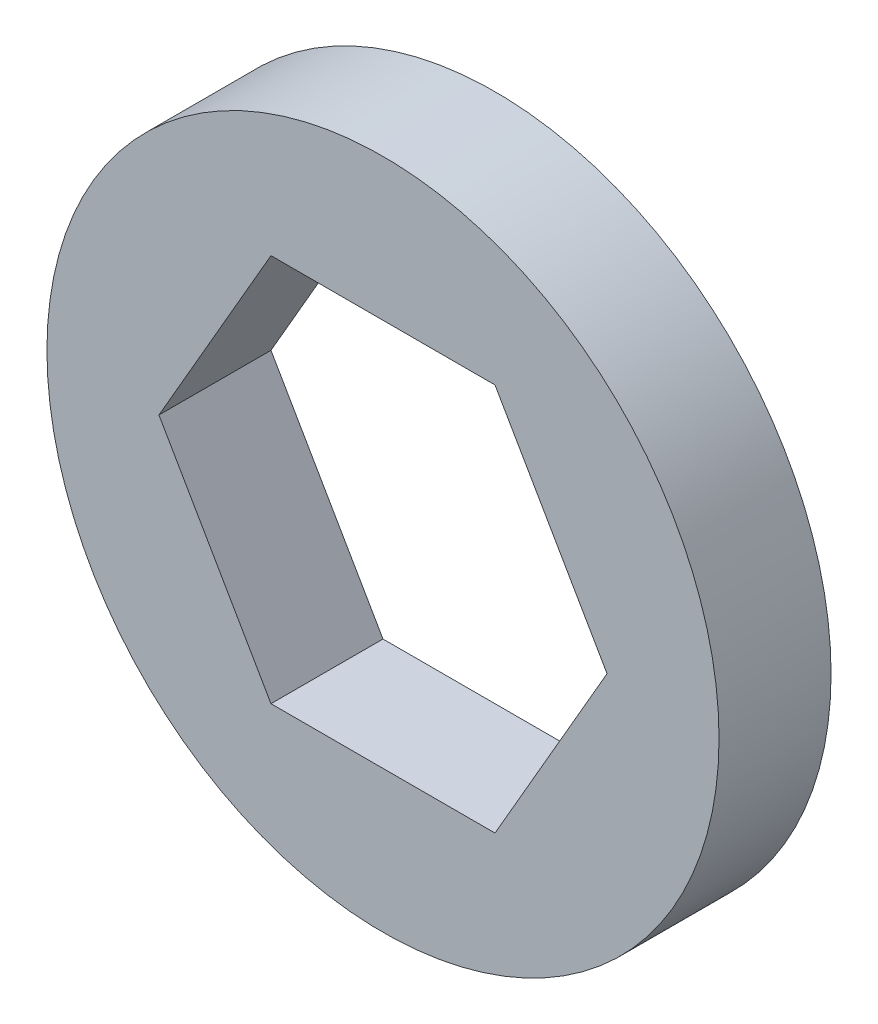
ISO-10303-21;
HEADER;
FILE_DESCRIPTION(('STEP AP214'),'2;1');
FILE_NAME('part.step','',(''),(''),'','','');
FILE_SCHEMA(('AUTOMOTIVE_DESIGN { 1 0 10303 214 1 1 1 1 }'));
ENDSEC;
DATA;
#1=APPLICATION_CONTEXT('core data for automotive mechanical design processes');
#2=APPLICATION_PROTOCOL_DEFINITION('international standard','automotive_design',2000,#1);
#3=PRODUCT_CONTEXT('',#1,'mechanical');
#4=PRODUCT('Part','Part','',(#3));
#5=PRODUCT_RELATED_PRODUCT_CATEGORY('part','',(#4));
#6=PRODUCT_DEFINITION_FORMATION('','',#4);
#7=PRODUCT_DEFINITION_CONTEXT('part definition',#1,'design');
#8=PRODUCT_DEFINITION('design','',#6,#7);
#9=PRODUCT_DEFINITION_SHAPE('','',#8);
#10=(LENGTH_UNIT() NAMED_UNIT(*) SI_UNIT(.MILLI.,.METRE.));
#11=(NAMED_UNIT(*) PLANE_ANGLE_UNIT() SI_UNIT($,.RADIAN.));
#12=(NAMED_UNIT(*) SI_UNIT($,.STERADIAN.) SOLID_ANGLE_UNIT());
#13=UNCERTAINTY_MEASURE_WITH_UNIT(LENGTH_MEASURE(1.E-05),#10,'distance_accuracy_value','');
#14=(GEOMETRIC_REPRESENTATION_CONTEXT(3) GLOBAL_UNCERTAINTY_ASSIGNED_CONTEXT((#13)) GLOBAL_UNIT_ASSIGNED_CONTEXT((#10,
#11,#12)) REPRESENTATION_CONTEXT('',''));
#15=CARTESIAN_POINT('',(0.,0.,0.));
#16=DIRECTION('',(0.,0.,1.));
#17=DIRECTION('',(1.,0.,0.));
#18=AXIS2_PLACEMENT_3D('',#15,#16,#17);
#19=CARTESIAN_POINT('',(0.,0.,3.175));
#20=DIRECTION('',(0.,0.,1.));
#21=DIRECTION('',(1.,0.,0.));
#22=AXIS2_PLACEMENT_3D('',#19,#20,#21);
#23=PLANE('',#22);
#24=CARTESIAN_POINT('',(0.,0.,3.175));
#25=DIRECTION('',(0.,0.,1.));
#26=DIRECTION('',(1.,0.,0.));
#27=AXIS2_PLACEMENT_3D('',#24,#25,#26);
#28=CIRCLE('',#27,9.525);
#29=CARTESIAN_POINT('',(9.525,0.,3.175));
#30=VERTEX_POINT('',#29);
#31=EDGE_CURVE('E11',#30,#30,#28,.T.);
#32=ORIENTED_EDGE('',*,*,#31,.T.);
#33=EDGE_LOOP('',(#32));
#34=FACE_BOUND('',#33,.T.);
#35=DIRECTION('',(-0.5,-0.866025403784438,0.));
#36=VECTOR('',#35,1.);
#37=CARTESIAN_POINT('',(-3.175,5.49926131403119,3.175));
#38=LINE('',#37,#36);
#39=CARTESIAN_POINT('',(-3.175,5.49926131403119,3.175));
#40=VERTEX_POINT('',#39);
#41=CARTESIAN_POINT('',(-6.35,0.,3.175));
#42=VERTEX_POINT('',#41);
#43=EDGE_CURVE('E99',#40,#42,#38,.T.);
#44=ORIENTED_EDGE('',*,*,#43,.F.);
#45=DIRECTION('',(-1.,0.,0.));
#46=VECTOR('',#45,1.);
#47=CARTESIAN_POINT('',(3.175,5.49926131403119,3.175));
#48=LINE('',#47,#46);
#49=CARTESIAN_POINT('',(3.175,5.49926131403119,3.175));
#50=VERTEX_POINT('',#49);
#51=EDGE_CURVE('E91',#50,#40,#48,.T.);
#52=ORIENTED_EDGE('',*,*,#51,.F.);
#53=DIRECTION('',(-0.5,0.866025403784438,0.));
#54=VECTOR('',#53,1.);
#55=CARTESIAN_POINT('',(6.35,0.,3.175));
#56=LINE('',#55,#54);
#57=CARTESIAN_POINT('',(6.35,0.,3.175));
#58=VERTEX_POINT('',#57);
#59=EDGE_CURVE('E119',#58,#50,#56,.T.);
#60=ORIENTED_EDGE('',*,*,#59,.F.);
#61=DIRECTION('',(0.5,0.866025403784438,0.));
#62=VECTOR('',#61,1.);
#63=CARTESIAN_POINT('',(3.175,-5.49926131403118,3.175));
#64=LINE('',#63,#62);
#65=CARTESIAN_POINT('',(3.175,-5.49926131403118,3.175));
#66=VERTEX_POINT('',#65);
#67=EDGE_CURVE('E117',#66,#58,#64,.T.);
#68=ORIENTED_EDGE('',*,*,#67,.F.);
#69=DIRECTION('',(1.,0.,0.));
#70=VECTOR('',#69,1.);
#71=CARTESIAN_POINT('',(-3.175,-5.49926131403119,3.175));
#72=LINE('',#71,#70);
#73=CARTESIAN_POINT('',(-3.175,-5.49926131403119,3.175));
#74=VERTEX_POINT('',#73);
#75=EDGE_CURVE('E113',#74,#66,#72,.T.);
#76=ORIENTED_EDGE('',*,*,#75,.F.);
#77=DIRECTION('',(0.5,-0.866025403784438,0.));
#78=VECTOR('',#77,1.);
#79=CARTESIAN_POINT('',(-6.35,0.,3.175));
#80=LINE('',#79,#78);
#81=EDGE_CURVE('E111',#42,#74,#80,.T.);
#82=ORIENTED_EDGE('',*,*,#81,.F.);
#83=EDGE_LOOP('',(#44,#52,#60,#68,#76,#82));
#84=FACE_BOUND('',#83,.T.);
#85=ADVANCED_FACE('F38',(#34,#84),#23,.T.);
#86=CARTESIAN_POINT('',(0.,0.,0.));
#87=DIRECTION('',(0.,0.,1.));
#88=DIRECTION('',(1.,0.,0.));
#89=AXIS2_PLACEMENT_3D('',#86,#87,#88);
#90=PLANE('',#89);
#91=CARTESIAN_POINT('',(0.,0.,0.));
#92=DIRECTION('',(0.,0.,1.));
#93=DIRECTION('',(1.,0.,0.));
#94=AXIS2_PLACEMENT_3D('',#91,#92,#93);
#95=CIRCLE('',#94,9.525);
#96=CARTESIAN_POINT('',(9.525,0.,0.));
#97=VERTEX_POINT('',#96);
#98=EDGE_CURVE('E42',#97,#97,#95,.T.);
#99=ORIENTED_EDGE('',*,*,#98,.F.);
#100=EDGE_LOOP('',(#99));
#101=FACE_BOUND('',#100,.T.);
#102=DIRECTION('',(-1.,0.,0.));
#103=VECTOR('',#102,1.);
#104=CARTESIAN_POINT('',(3.175,5.49926131403119,0.));
#105=LINE('',#104,#103);
#106=CARTESIAN_POINT('',(3.175,5.49926131403119,0.));
#107=VERTEX_POINT('',#106);
#108=CARTESIAN_POINT('',(-3.175,5.49926131403119,0.));
#109=VERTEX_POINT('',#108);
#110=EDGE_CURVE('E61',#107,#109,#105,.T.);
#111=ORIENTED_EDGE('',*,*,#110,.T.);
#112=DIRECTION('',(-0.5,-0.866025403784438,0.));
#113=VECTOR('',#112,1.);
#114=CARTESIAN_POINT('',(-3.175,5.49926131403119,0.));
#115=LINE('',#114,#113);
#116=CARTESIAN_POINT('',(-6.35,0.,0.));
#117=VERTEX_POINT('',#116);
#118=EDGE_CURVE('E106',#109,#117,#115,.T.);
#119=ORIENTED_EDGE('',*,*,#118,.T.);
#120=DIRECTION('',(0.5,-0.866025403784438,0.));
#121=VECTOR('',#120,1.);
#122=CARTESIAN_POINT('',(-6.35,0.,0.));
#123=LINE('',#122,#121);
#124=CARTESIAN_POINT('',(-3.175,-5.49926131403119,0.));
#125=VERTEX_POINT('',#124);
#126=EDGE_CURVE('E123',#117,#125,#123,.T.);
#127=ORIENTED_EDGE('',*,*,#126,.T.);
#128=DIRECTION('',(1.,0.,0.));
#129=VECTOR('',#128,1.);
#130=CARTESIAN_POINT('',(-3.175,-5.49926131403119,0.));
#131=LINE('',#130,#129);
#132=CARTESIAN_POINT('',(3.175,-5.49926131403118,0.));
#133=VERTEX_POINT('',#132);
#134=EDGE_CURVE('E126',#125,#133,#131,.T.);
#135=ORIENTED_EDGE('',*,*,#134,.T.);
#136=DIRECTION('',(0.5,0.866025403784438,0.));
#137=VECTOR('',#136,1.);
#138=CARTESIAN_POINT('',(3.175,-5.49926131403118,0.));
#139=LINE('',#138,#137);
#140=CARTESIAN_POINT('',(6.35,0.,0.));
#141=VERTEX_POINT('',#140);
#142=EDGE_CURVE('E129',#133,#141,#139,.T.);
#143=ORIENTED_EDGE('',*,*,#142,.T.);
#144=DIRECTION('',(-0.5,0.866025403784438,0.));
#145=VECTOR('',#144,1.);
#146=CARTESIAN_POINT('',(6.35,0.,0.));
#147=LINE('',#146,#145);
#148=EDGE_CURVE('E100',#141,#107,#147,.T.);
#149=ORIENTED_EDGE('',*,*,#148,.T.);
#150=EDGE_LOOP('',(#111,#119,#127,#135,#143,#149));
#151=FACE_BOUND('',#150,.T.);
#152=ADVANCED_FACE('F146',(#101,#151),#90,.F.);
#153=CARTESIAN_POINT('',(0.,0.,3.175));
#154=DIRECTION('',(0.,0.,-1.));
#155=DIRECTION('',(-1.,0.,0.));
#156=AXIS2_PLACEMENT_3D('',#153,#154,#155);
#157=CYLINDRICAL_SURFACE('',#156,9.525);
#158=ORIENTED_EDGE('',*,*,#31,.F.);
#159=EDGE_LOOP('',(#158));
#160=FACE_BOUND('',#159,.T.);
#161=ORIENTED_EDGE('',*,*,#98,.T.);
#162=EDGE_LOOP('',(#161));
#163=FACE_BOUND('',#162,.T.);
#164=ADVANCED_FACE('F40',(#160,#163),#157,.T.);
#165=CARTESIAN_POINT('',(3.175,5.49926131403119,3.175));
#166=DIRECTION('',(0.,-1.,0.));
#167=DIRECTION('',(0.,0.,-1.));
#168=AXIS2_PLACEMENT_3D('',#165,#166,#167);
#169=PLANE('',#168);
#170=ORIENTED_EDGE('',*,*,#110,.F.);
#171=DIRECTION('',(0.,0.,-1.));
#172=VECTOR('',#171,1.);
#173=CARTESIAN_POINT('',(3.175,5.49926131403119,3.175));
#174=LINE('',#173,#172);
#175=EDGE_CURVE('E95',#50,#107,#174,.T.);
#176=ORIENTED_EDGE('',*,*,#175,.F.);
#177=ORIENTED_EDGE('',*,*,#51,.T.);
#178=DIRECTION('',(0.,0.,-1.));
#179=VECTOR('',#178,1.);
#180=CARTESIAN_POINT('',(-3.175,5.49926131403119,3.175));
#181=LINE('',#180,#179);
#182=EDGE_CURVE('E94',#40,#109,#181,.T.);
#183=ORIENTED_EDGE('',*,*,#182,.T.);
#184=EDGE_LOOP('',(#170,#176,#177,#183));
#185=FACE_BOUND('',#184,.T.);
#186=ADVANCED_FACE('F93',(#185),#169,.T.);
#187=CARTESIAN_POINT('',(-3.175,5.49926131403119,3.175));
#188=DIRECTION('',(0.866025403784439,-0.5,0.));
#189=DIRECTION('',(0.5,0.866025403784439,0.));
#190=AXIS2_PLACEMENT_3D('',#187,#188,#189);
#191=PLANE('',#190);
#192=ORIENTED_EDGE('',*,*,#118,.F.);
#193=ORIENTED_EDGE('',*,*,#182,.F.);
#194=ORIENTED_EDGE('',*,*,#43,.T.);
#195=DIRECTION('',(0.,0.,-1.));
#196=VECTOR('',#195,1.);
#197=CARTESIAN_POINT('',(-6.35,0.,3.175));
#198=LINE('',#197,#196);
#199=EDGE_CURVE('E107',#42,#117,#198,.T.);
#200=ORIENTED_EDGE('',*,*,#199,.T.);
#201=EDGE_LOOP('',(#192,#193,#194,#200));
#202=FACE_BOUND('',#201,.T.);
#203=ADVANCED_FACE('F103',(#202),#191,.T.);
#204=CARTESIAN_POINT('',(-6.35,0.,3.175));
#205=DIRECTION('',(0.866025403784438,0.5,0.));
#206=DIRECTION('',(-0.5,0.866025403784439,0.));
#207=AXIS2_PLACEMENT_3D('',#204,#205,#206);
#208=PLANE('',#207);
#209=ORIENTED_EDGE('',*,*,#126,.F.);
#210=ORIENTED_EDGE('',*,*,#199,.F.);
#211=ORIENTED_EDGE('',*,*,#81,.T.);
#212=DIRECTION('',(0.,0.,-1.));
#213=VECTOR('',#212,1.);
#214=CARTESIAN_POINT('',(-3.175,-5.49926131403119,3.175));
#215=LINE('',#214,#213);
#216=EDGE_CURVE('E138',#74,#125,#215,.T.);
#217=ORIENTED_EDGE('',*,*,#216,.T.);
#218=EDGE_LOOP('',(#209,#210,#211,#217));
#219=FACE_BOUND('',#218,.T.);
#220=ADVANCED_FACE('F142',(#219),#208,.T.);
#221=CARTESIAN_POINT('',(-3.175,-5.49926131403119,3.175));
#222=DIRECTION('',(0.,1.,0.));
#223=DIRECTION('',(-1.,0.,0.));
#224=AXIS2_PLACEMENT_3D('',#221,#222,#223);
#225=PLANE('',#224);
#226=ORIENTED_EDGE('',*,*,#134,.F.);
#227=ORIENTED_EDGE('',*,*,#216,.F.);
#228=ORIENTED_EDGE('',*,*,#75,.T.);
#229=DIRECTION('',(0.,0.,-1.));
#230=VECTOR('',#229,1.);
#231=CARTESIAN_POINT('',(3.175,-5.49926131403118,3.175));
#232=LINE('',#231,#230);
#233=EDGE_CURVE('E136',#66,#133,#232,.T.);
#234=ORIENTED_EDGE('',*,*,#233,.T.);
#235=EDGE_LOOP('',(#226,#227,#228,#234));
#236=FACE_BOUND('',#235,.T.);
#237=ADVANCED_FACE('F154',(#236),#225,.T.);
#238=CARTESIAN_POINT('',(3.175,-5.49926131403118,3.175));
#239=DIRECTION('',(-0.866025403784439,0.5,0.));
#240=DIRECTION('',(-0.5,-0.866025403784439,0.));
#241=AXIS2_PLACEMENT_3D('',#238,#239,#240);
#242=PLANE('',#241);
#243=ORIENTED_EDGE('',*,*,#142,.F.);
#244=ORIENTED_EDGE('',*,*,#233,.F.);
#245=ORIENTED_EDGE('',*,*,#67,.T.);
#246=DIRECTION('',(0.,0.,-1.));
#247=VECTOR('',#246,1.);
#248=CARTESIAN_POINT('',(6.35,0.,3.175));
#249=LINE('',#248,#247);
#250=EDGE_CURVE('E53',#58,#141,#249,.T.);
#251=ORIENTED_EDGE('',*,*,#250,.T.);
#252=EDGE_LOOP('',(#243,#244,#245,#251));
#253=FACE_BOUND('',#252,.T.);
#254=ADVANCED_FACE('F152',(#253),#242,.T.);
#255=CARTESIAN_POINT('',(6.35,0.,3.175));
#256=DIRECTION('',(-0.866025403784438,-0.5,0.));
#257=DIRECTION('',(0.5,-0.866025403784438,0.));
#258=AXIS2_PLACEMENT_3D('',#255,#256,#257);
#259=PLANE('',#258);
#260=ORIENTED_EDGE('',*,*,#148,.F.);
#261=ORIENTED_EDGE('',*,*,#250,.F.);
#262=ORIENTED_EDGE('',*,*,#59,.T.);
#263=ORIENTED_EDGE('',*,*,#175,.T.);
#264=EDGE_LOOP('',(#260,#261,#262,#263));
#265=FACE_BOUND('',#264,.T.);
#266=ADVANCED_FACE('F148',(#265),#259,.T.);
#267=CLOSED_SHELL('',(#85,#152,#164,#186,#203,#220,#237,#254,#266));
#268=MANIFOLD_SOLID_BREP('B2',#267);
#269=ADVANCED_BREP_SHAPE_REPRESENTATION('',(#18,#268),#14);
#270=SHAPE_DEFINITION_REPRESENTATION(#9,#269);
ENDSEC;
END-ISO-10303-21;
